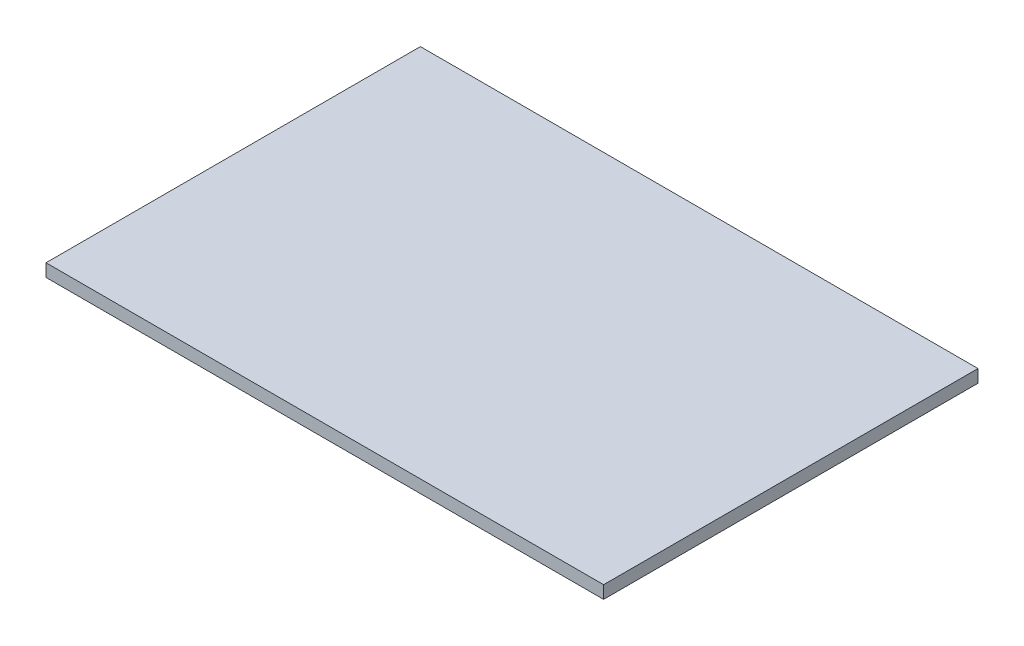
ISO-10303-21;
HEADER;
FILE_DESCRIPTION(('STEP AP214'),'2;1');
FILE_NAME('part.step','',(''),(''),'','','');
FILE_SCHEMA(('AUTOMOTIVE_DESIGN { 1 0 10303 214 1 1 1 1 }'));
ENDSEC;
DATA;
#1=APPLICATION_CONTEXT('core data for automotive mechanical design processes');
#2=APPLICATION_PROTOCOL_DEFINITION('international standard','automotive_design',2000,#1);
#3=PRODUCT_CONTEXT('',#1,'mechanical');
#4=PRODUCT('Part','Part','',(#3));
#5=PRODUCT_RELATED_PRODUCT_CATEGORY('part','',(#4));
#6=PRODUCT_DEFINITION_FORMATION('','',#4);
#7=PRODUCT_DEFINITION_CONTEXT('part definition',#1,'design');
#8=PRODUCT_DEFINITION('design','',#6,#7);
#9=PRODUCT_DEFINITION_SHAPE('','',#8);
#10=(LENGTH_UNIT() NAMED_UNIT(*) SI_UNIT(.MILLI.,.METRE.));
#11=(NAMED_UNIT(*) PLANE_ANGLE_UNIT() SI_UNIT($,.RADIAN.));
#12=(NAMED_UNIT(*) SI_UNIT($,.STERADIAN.) SOLID_ANGLE_UNIT());
#13=UNCERTAINTY_MEASURE_WITH_UNIT(LENGTH_MEASURE(1.E-05),#10,'distance_accuracy_value','');
#14=(GEOMETRIC_REPRESENTATION_CONTEXT(3) GLOBAL_UNCERTAINTY_ASSIGNED_CONTEXT((#13)) GLOBAL_UNIT_ASSIGNED_CONTEXT((#10,
#11,#12)) REPRESENTATION_CONTEXT('',''));
#15=CARTESIAN_POINT('',(0.,0.,0.));
#16=DIRECTION('',(0.,0.,1.));
#17=DIRECTION('',(1.,0.,0.));
#18=AXIS2_PLACEMENT_3D('',#15,#16,#17);
#19=CARTESIAN_POINT('',(35.,1.6,-23.5));
#20=DIRECTION('',(-1.,0.,0.));
#21=DIRECTION('',(0.,0.,1.));
#22=AXIS2_PLACEMENT_3D('',#19,#20,#21);
#23=PLANE('',#22);
#24=DIRECTION('',(0.,0.,-1.));
#25=VECTOR('',#24,1.);
#26=CARTESIAN_POINT('',(35.,0.,-23.5));
#27=LINE('',#26,#25);
#28=CARTESIAN_POINT('',(35.,0.,23.5));
#29=VERTEX_POINT('',#28);
#30=CARTESIAN_POINT('',(35.,0.,-23.5));
#31=VERTEX_POINT('',#30);
#32=EDGE_CURVE('E96',#29,#31,#27,.T.);
#33=ORIENTED_EDGE('',*,*,#32,.T.);
#34=DIRECTION('',(0.,-1.,0.));
#35=VECTOR('',#34,1.);
#36=CARTESIAN_POINT('',(35.,1.6,-23.5));
#37=LINE('',#36,#35);
#38=CARTESIAN_POINT('',(35.,1.6,-23.5));
#39=VERTEX_POINT('',#38);
#40=EDGE_CURVE('E11',#39,#31,#37,.T.);
#41=ORIENTED_EDGE('',*,*,#40,.F.);
#42=DIRECTION('',(0.,0.,-1.));
#43=VECTOR('',#42,1.);
#44=CARTESIAN_POINT('',(35.,1.6,-23.5));
#45=LINE('',#44,#43);
#46=CARTESIAN_POINT('',(35.,1.6,23.5));
#47=VERTEX_POINT('',#46);
#48=EDGE_CURVE('E84',#47,#39,#45,.T.);
#49=ORIENTED_EDGE('',*,*,#48,.F.);
#50=DIRECTION('',(0.,-1.,0.));
#51=VECTOR('',#50,1.);
#52=CARTESIAN_POINT('',(35.,1.6,23.5));
#53=LINE('',#52,#51);
#54=EDGE_CURVE('E92',#47,#29,#53,.T.);
#55=ORIENTED_EDGE('',*,*,#54,.T.);
#56=EDGE_LOOP('',(#33,#41,#49,#55));
#57=FACE_BOUND('',#56,.T.);
#58=ADVANCED_FACE('F33',(#57),#23,.F.);
#59=CARTESIAN_POINT('',(-35.,1.6,-23.5));
#60=DIRECTION('',(0.,0.,1.));
#61=DIRECTION('',(1.,0.,0.));
#62=AXIS2_PLACEMENT_3D('',#59,#60,#61);
#63=PLANE('',#62);
#64=DIRECTION('',(-1.,0.,0.));
#65=VECTOR('',#64,1.);
#66=CARTESIAN_POINT('',(-35.,0.,-23.5));
#67=LINE('',#66,#65);
#68=CARTESIAN_POINT('',(-35.,0.,-23.5));
#69=VERTEX_POINT('',#68);
#70=EDGE_CURVE('E88',#31,#69,#67,.T.);
#71=ORIENTED_EDGE('',*,*,#70,.T.);
#72=DIRECTION('',(0.,-1.,0.));
#73=VECTOR('',#72,1.);
#74=CARTESIAN_POINT('',(-35.,1.6,-23.5));
#75=LINE('',#74,#73);
#76=CARTESIAN_POINT('',(-35.,1.6,-23.5));
#77=VERTEX_POINT('',#76);
#78=EDGE_CURVE('E41',#77,#69,#75,.T.);
#79=ORIENTED_EDGE('',*,*,#78,.F.);
#80=DIRECTION('',(-1.,0.,0.));
#81=VECTOR('',#80,1.);
#82=CARTESIAN_POINT('',(-35.,1.6,-23.5));
#83=LINE('',#82,#81);
#84=EDGE_CURVE('E79',#39,#77,#83,.T.);
#85=ORIENTED_EDGE('',*,*,#84,.F.);
#86=ORIENTED_EDGE('',*,*,#40,.T.);
#87=EDGE_LOOP('',(#71,#79,#85,#86));
#88=FACE_BOUND('',#87,.T.);
#89=ADVANCED_FACE('F87',(#88),#63,.F.);
#90=CARTESIAN_POINT('',(-35.,1.6,-23.5));
#91=DIRECTION('',(1.,0.,0.));
#92=DIRECTION('',(0.,0.,-1.));
#93=AXIS2_PLACEMENT_3D('',#90,#91,#92);
#94=PLANE('',#93);
#95=DIRECTION('',(0.,0.,1.));
#96=VECTOR('',#95,1.);
#97=CARTESIAN_POINT('',(-35.,0.,-23.5));
#98=LINE('',#97,#96);
#99=CARTESIAN_POINT('',(-35.,0.,23.5));
#100=VERTEX_POINT('',#99);
#101=EDGE_CURVE('E66',#69,#100,#98,.T.);
#102=ORIENTED_EDGE('',*,*,#101,.T.);
#103=DIRECTION('',(0.,-1.,0.));
#104=VECTOR('',#103,1.);
#105=CARTESIAN_POINT('',(-35.,1.6,23.5));
#106=LINE('',#105,#104);
#107=CARTESIAN_POINT('',(-35.,1.6,23.5));
#108=VERTEX_POINT('',#107);
#109=EDGE_CURVE('E89',#108,#100,#106,.T.);
#110=ORIENTED_EDGE('',*,*,#109,.F.);
#111=DIRECTION('',(0.,0.,1.));
#112=VECTOR('',#111,1.);
#113=CARTESIAN_POINT('',(-35.,1.6,-23.5));
#114=LINE('',#113,#112);
#115=EDGE_CURVE('E82',#77,#108,#114,.T.);
#116=ORIENTED_EDGE('',*,*,#115,.F.);
#117=ORIENTED_EDGE('',*,*,#78,.T.);
#118=EDGE_LOOP('',(#102,#110,#116,#117));
#119=FACE_BOUND('',#118,.T.);
#120=ADVANCED_FACE('F90',(#119),#94,.F.);
#121=CARTESIAN_POINT('',(-35.,1.6,23.5));
#122=DIRECTION('',(0.,0.,-1.));
#123=DIRECTION('',(-1.,0.,0.));
#124=AXIS2_PLACEMENT_3D('',#121,#122,#123);
#125=PLANE('',#124);
#126=DIRECTION('',(1.,0.,0.));
#127=VECTOR('',#126,1.);
#128=CARTESIAN_POINT('',(-35.,0.,23.5));
#129=LINE('',#128,#127);
#130=EDGE_CURVE('E72',#100,#29,#129,.T.);
#131=ORIENTED_EDGE('',*,*,#130,.T.);
#132=ORIENTED_EDGE('',*,*,#54,.F.);
#133=DIRECTION('',(1.,0.,0.));
#134=VECTOR('',#133,1.);
#135=CARTESIAN_POINT('',(-35.,1.6,23.5));
#136=LINE('',#135,#134);
#137=EDGE_CURVE('E49',#108,#47,#136,.T.);
#138=ORIENTED_EDGE('',*,*,#137,.F.);
#139=ORIENTED_EDGE('',*,*,#109,.T.);
#140=EDGE_LOOP('',(#131,#132,#138,#139));
#141=FACE_BOUND('',#140,.T.);
#142=ADVANCED_FACE('F103',(#141),#125,.F.);
#143=CARTESIAN_POINT('',(0.,1.6,0.));
#144=DIRECTION('',(0.,1.,0.));
#145=DIRECTION('',(0.,0.,1.));
#146=AXIS2_PLACEMENT_3D('',#143,#144,#145);
#147=PLANE('',#146);
#148=ORIENTED_EDGE('',*,*,#48,.T.);
#149=ORIENTED_EDGE('',*,*,#84,.T.);
#150=ORIENTED_EDGE('',*,*,#115,.T.);
#151=ORIENTED_EDGE('',*,*,#137,.T.);
#152=EDGE_LOOP('',(#148,#149,#150,#151));
#153=FACE_BOUND('',#152,.T.);
#154=ADVANCED_FACE('F80',(#153),#147,.T.);
#155=CARTESIAN_POINT('',(0.,0.,0.));
#156=DIRECTION('',(0.,1.,0.));
#157=DIRECTION('',(0.,0.,1.));
#158=AXIS2_PLACEMENT_3D('',#155,#156,#157);
#159=PLANE('',#158);
#160=ORIENTED_EDGE('',*,*,#32,.F.);
#161=ORIENTED_EDGE('',*,*,#130,.F.);
#162=ORIENTED_EDGE('',*,*,#101,.F.);
#163=ORIENTED_EDGE('',*,*,#70,.F.);
#164=EDGE_LOOP('',(#160,#161,#162,#163));
#165=FACE_BOUND('',#164,.T.);
#166=ADVANCED_FACE('F106',(#165),#159,.F.);
#167=CLOSED_SHELL('',(#58,#89,#120,#142,#154,#166));
#168=MANIFOLD_SOLID_BREP('B2',#167);
#169=ADVANCED_BREP_SHAPE_REPRESENTATION('',(#18,#168),#14);
#170=SHAPE_DEFINITION_REPRESENTATION(#9,#169);
ENDSEC;
END-ISO-10303-21;
